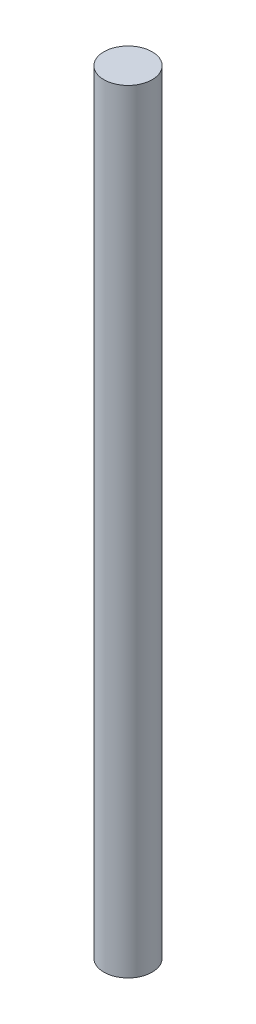
ISO-10303-21;
HEADER;
FILE_DESCRIPTION(('STEP AP214'),'2;1');
FILE_NAME('part.step','',(''),(''),'','','');
FILE_SCHEMA(('AUTOMOTIVE_DESIGN { 1 0 10303 214 1 1 1 1 }'));
ENDSEC;
DATA;
#1=APPLICATION_CONTEXT('core data for automotive mechanical design processes');
#2=APPLICATION_PROTOCOL_DEFINITION('international standard','automotive_design',2000,#1);
#3=PRODUCT_CONTEXT('',#1,'mechanical');
#4=PRODUCT('Part','Part','',(#3));
#5=PRODUCT_RELATED_PRODUCT_CATEGORY('part','',(#4));
#6=PRODUCT_DEFINITION_FORMATION('','',#4);
#7=PRODUCT_DEFINITION_CONTEXT('part definition',#1,'design');
#8=PRODUCT_DEFINITION('design','',#6,#7);
#9=PRODUCT_DEFINITION_SHAPE('','',#8);
#10=(LENGTH_UNIT() NAMED_UNIT(*) SI_UNIT(.MILLI.,.METRE.));
#11=(NAMED_UNIT(*) PLANE_ANGLE_UNIT() SI_UNIT($,.RADIAN.));
#12=(NAMED_UNIT(*) SI_UNIT($,.STERADIAN.) SOLID_ANGLE_UNIT());
#13=UNCERTAINTY_MEASURE_WITH_UNIT(LENGTH_MEASURE(1.E-05),#10,'distance_accuracy_value','');
#14=(GEOMETRIC_REPRESENTATION_CONTEXT(3) GLOBAL_UNCERTAINTY_ASSIGNED_CONTEXT((#13)) GLOBAL_UNIT_ASSIGNED_CONTEXT((#10,
#11,#12)) REPRESENTATION_CONTEXT('',''));
#15=CARTESIAN_POINT('',(0.,0.,0.));
#16=DIRECTION('',(0.,0.,1.));
#17=DIRECTION('',(1.,0.,0.));
#18=AXIS2_PLACEMENT_3D('',#15,#16,#17);
#19=CARTESIAN_POINT('',(0.,2438.4,0.));
#20=DIRECTION('',(0.,-1.,0.));
#21=DIRECTION('',(0.,0.,-1.));
#22=AXIS2_PLACEMENT_3D('',#19,#20,#21);
#23=CYLINDRICAL_SURFACE('',#22,76.2);
#24=CARTESIAN_POINT('',(0.,2438.4,0.));
#25=DIRECTION('',(0.,1.,0.));
#26=DIRECTION('',(0.,0.,1.));
#27=AXIS2_PLACEMENT_3D('',#24,#25,#26);
#28=CIRCLE('',#27,76.2);
#29=CARTESIAN_POINT('',(0.,2438.4,-76.2));
#30=VERTEX_POINT('',#29);
#31=EDGE_CURVE('E10',#30,#30,#28,.T.);
#32=CARTESIAN_POINT('',(0.,0.,0.));
#33=DIRECTION('',(0.,1.,0.));
#34=DIRECTION('',(0.,0.,1.));
#35=AXIS2_PLACEMENT_3D('',#32,#33,#34);
#36=CIRCLE('',#35,76.2);
#37=CARTESIAN_POINT('',(0.,0.,-76.2));
#38=VERTEX_POINT('',#37);
#39=EDGE_CURVE('E34',#38,#38,#36,.T.);
#40=CARTESIAN_POINT('',(0.,2438.4,-76.2));
#41=CARTESIAN_POINT('',(0.,2413.,-76.2));
#42=CARTESIAN_POINT('',(0.,2387.6,-76.2));
#43=CARTESIAN_POINT('',(0.,2336.8,-76.2));
#44=CARTESIAN_POINT('',(0.,2311.4,-76.2));
#45=CARTESIAN_POINT('',(0.,2260.6,-76.2));
#46=CARTESIAN_POINT('',(0.,2235.2,-76.2));
#47=CARTESIAN_POINT('',(0.,2184.4,-76.2));
#48=CARTESIAN_POINT('',(0.,2159.,-76.2));
#49=CARTESIAN_POINT('',(0.,2108.2,-76.2));
#50=CARTESIAN_POINT('',(0.,2082.8,-76.2));
#51=CARTESIAN_POINT('',(0.,2032.,-76.2));
#52=CARTESIAN_POINT('',(0.,2006.6,-76.2));
#53=CARTESIAN_POINT('',(0.,1955.8,-76.2));
#54=CARTESIAN_POINT('',(0.,1930.4,-76.2));
#55=CARTESIAN_POINT('',(0.,1879.6,-76.2));
#56=CARTESIAN_POINT('',(0.,1854.2,-76.2));
#57=CARTESIAN_POINT('',(0.,1803.4,-76.2));
#58=CARTESIAN_POINT('',(0.,1778.,-76.2));
#59=CARTESIAN_POINT('',(0.,1727.2,-76.2));
#60=CARTESIAN_POINT('',(0.,1701.8,-76.2));
#61=CARTESIAN_POINT('',(0.,1651.,-76.2));
#62=CARTESIAN_POINT('',(0.,1625.6,-76.2));
#63=CARTESIAN_POINT('',(0.,1574.8,-76.2));
#64=CARTESIAN_POINT('',(0.,1549.4,-76.2));
#65=CARTESIAN_POINT('',(0.,1498.6,-76.2));
#66=CARTESIAN_POINT('',(0.,1473.2,-76.2));
#67=CARTESIAN_POINT('',(0.,1422.4,-76.2));
#68=CARTESIAN_POINT('',(0.,1397.,-76.2));
#69=CARTESIAN_POINT('',(0.,1346.2,-76.2));
#70=CARTESIAN_POINT('',(0.,1320.8,-76.2));
#71=CARTESIAN_POINT('',(0.,1270.,-76.2));
#72=CARTESIAN_POINT('',(0.,1244.6,-76.2));
#73=CARTESIAN_POINT('',(0.,1193.8,-76.2));
#74=CARTESIAN_POINT('',(0.,1168.4,-76.2));
#75=CARTESIAN_POINT('',(0.,1117.6,-76.2));
#76=CARTESIAN_POINT('',(0.,1092.2,-76.2));
#77=CARTESIAN_POINT('',(0.,1041.4,-76.2));
#78=CARTESIAN_POINT('',(0.,1016.,-76.2));
#79=CARTESIAN_POINT('',(0.,965.2,-76.2));
#80=CARTESIAN_POINT('',(0.,939.8,-76.2));
#81=CARTESIAN_POINT('',(0.,889.,-76.2));
#82=CARTESIAN_POINT('',(0.,863.6,-76.2));
#83=CARTESIAN_POINT('',(0.,812.8,-76.2));
#84=CARTESIAN_POINT('',(0.,787.4,-76.2));
#85=CARTESIAN_POINT('',(0.,736.6,-76.2));
#86=CARTESIAN_POINT('',(0.,711.2,-76.2));
#87=CARTESIAN_POINT('',(0.,660.4,-76.2));
#88=CARTESIAN_POINT('',(0.,635.,-76.2));
#89=CARTESIAN_POINT('',(0.,584.2,-76.2));
#90=CARTESIAN_POINT('',(0.,558.8,-76.2));
#91=CARTESIAN_POINT('',(0.,508.,-76.2));
#92=CARTESIAN_POINT('',(0.,482.6,-76.2));
#93=CARTESIAN_POINT('',(0.,431.8,-76.2));
#94=CARTESIAN_POINT('',(0.,406.4,-76.2));
#95=CARTESIAN_POINT('',(0.,355.6,-76.2));
#96=CARTESIAN_POINT('',(0.,330.2,-76.2));
#97=CARTESIAN_POINT('',(0.,279.4,-76.2));
#98=CARTESIAN_POINT('',(0.,254.,-76.2));
#99=CARTESIAN_POINT('',(0.,203.2,-76.2));
#100=CARTESIAN_POINT('',(0.,177.8,-76.2));
#101=CARTESIAN_POINT('',(0.,127.,-76.2));
#102=CARTESIAN_POINT('',(0.,101.6,-76.2));
#103=CARTESIAN_POINT('',(0.,50.8,-76.2));
#104=CARTESIAN_POINT('',(0.,25.4,-76.2));
#105=CARTESIAN_POINT('',(0.,0.,-76.2));
#106=B_SPLINE_CURVE_WITH_KNOTS('',3,(#40,#41,#42,#43,#44,#45,#46,#47,#48,#49,#50,#51,#52,#53,
#54,#55,#56,#57,#58,#59,#60,#61,#62,#63,#64,#65,#66,#67,#68,#69,#70,#71,#72,#73,#74,#75,#76,#77,
#78,#79,#80,#81,#82,#83,#84,#85,#86,#87,#88,#89,#90,#91,#92,#93,#94,#95,#96,#97,#98,#99,#100,
#101,#102,#103,#104,#105),.UNSPECIFIED.,.F.,.F.,(4,2,2,2,2,2,2,2,2,2,2,2,2,2,2,2,2,2,2,2,2,2,2,
2,2,2,2,2,2,2,2,2,4),(0.,76.1999999999996,152.4,228.6,304.8,381.,457.2,533.4,609.6,685.8,762.,
838.2,914.4,990.6,1066.8,1143.,1219.2,1295.4,1371.6,1447.8,1524.,1600.2,1676.4,1752.6,1828.8,
1905.,1981.2,2057.4,2133.6,2209.8,2286.,2362.2,2438.4),.UNSPECIFIED.);
#107=EDGE_CURVE('BSEAM31',#30,#38,#106,.T.);
#108=ORIENTED_EDGE('',*,*,#31,.F.);
#109=ORIENTED_EDGE('',*,*,#39,.T.);
#110=ORIENTED_EDGE('',*,*,#107,.T.);
#111=ORIENTED_EDGE('',*,*,#107,.F.);
#112=EDGE_LOOP('',(#108,#110,#109,#111));
#113=FACE_BOUND('',#112,.T.);
#114=ADVANCED_FACE('F31',(#113),#23,.T.);
#115=CARTESIAN_POINT('',(0.,2438.4,0.));
#116=DIRECTION('',(0.,1.,0.));
#117=DIRECTION('',(0.,0.,1.));
#118=AXIS2_PLACEMENT_3D('',#115,#116,#117);
#119=PLANE('',#118);
#120=ORIENTED_EDGE('',*,*,#31,.T.);
#121=EDGE_LOOP('',(#120));
#122=FACE_BOUND('',#121,.T.);
#123=ADVANCED_FACE('F46',(#122),#119,.T.);
#124=CARTESIAN_POINT('',(0.,0.,0.));
#125=DIRECTION('',(0.,1.,0.));
#126=DIRECTION('',(0.,0.,1.));
#127=AXIS2_PLACEMENT_3D('',#124,#125,#126);
#128=PLANE('',#127);
#129=ORIENTED_EDGE('',*,*,#39,.F.);
#130=EDGE_LOOP('',(#129));
#131=FACE_BOUND('',#130,.T.);
#132=ADVANCED_FACE('F44',(#131),#128,.F.);
#133=CLOSED_SHELL('',(#114,#123,#132));
#134=MANIFOLD_SOLID_BREP('B2',#133);
#135=ADVANCED_BREP_SHAPE_REPRESENTATION('',(#18,#134),#14);
#136=SHAPE_DEFINITION_REPRESENTATION(#9,#135);
ENDSEC;
END-ISO-10303-21;
